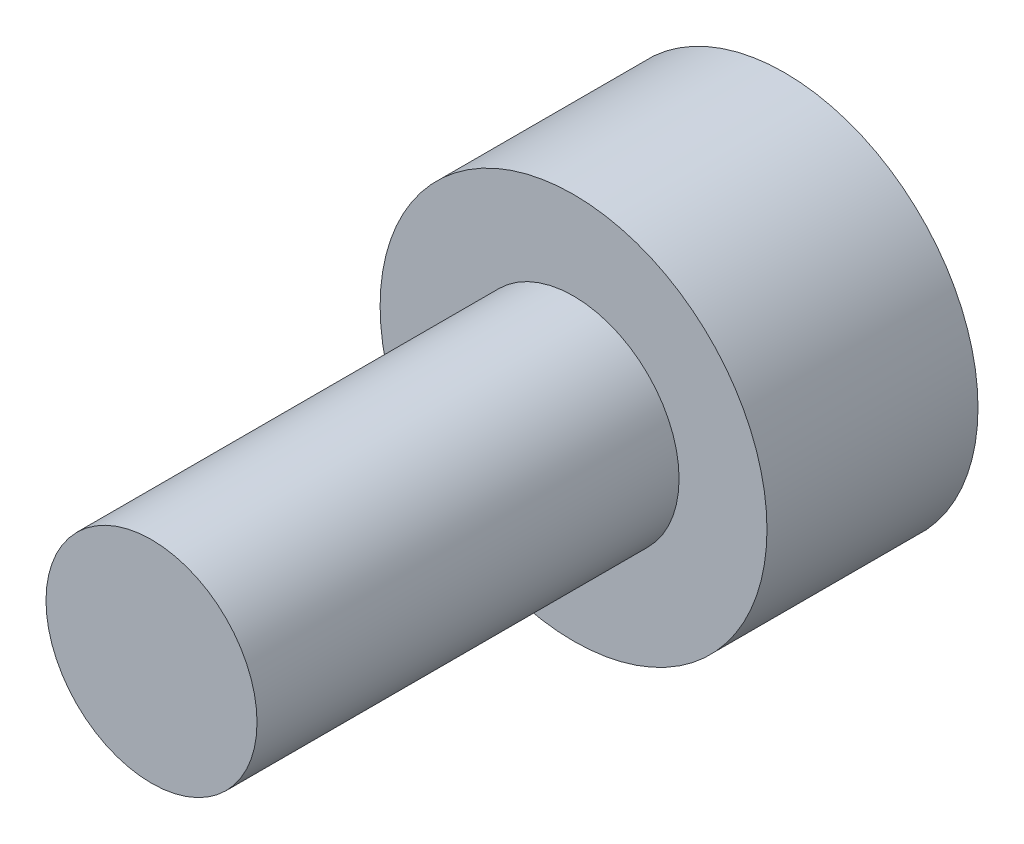
ISO-10303-21;
HEADER;
FILE_DESCRIPTION(('STEP AP214'),'2;1');
FILE_NAME('part.step','',(''),(''),'','','');
FILE_SCHEMA(('AUTOMOTIVE_DESIGN { 1 0 10303 214 1 1 1 1 }'));
ENDSEC;
DATA;
#1=APPLICATION_CONTEXT('core data for automotive mechanical design processes');
#2=APPLICATION_PROTOCOL_DEFINITION('international standard','automotive_design',2000,#1);
#3=PRODUCT_CONTEXT('',#1,'mechanical');
#4=PRODUCT('Part','Part','',(#3));
#5=PRODUCT_RELATED_PRODUCT_CATEGORY('part','',(#4));
#6=PRODUCT_DEFINITION_FORMATION('','',#4);
#7=PRODUCT_DEFINITION_CONTEXT('part definition',#1,'design');
#8=PRODUCT_DEFINITION('design','',#6,#7);
#9=PRODUCT_DEFINITION_SHAPE('','',#8);
#10=(LENGTH_UNIT() NAMED_UNIT(*) SI_UNIT(.MILLI.,.METRE.));
#11=(NAMED_UNIT(*) PLANE_ANGLE_UNIT() SI_UNIT($,.RADIAN.));
#12=(NAMED_UNIT(*) SI_UNIT($,.STERADIAN.) SOLID_ANGLE_UNIT());
#13=UNCERTAINTY_MEASURE_WITH_UNIT(LENGTH_MEASURE(1.E-05),#10,'distance_accuracy_value','');
#14=(GEOMETRIC_REPRESENTATION_CONTEXT(3) GLOBAL_UNCERTAINTY_ASSIGNED_CONTEXT((#13)) GLOBAL_UNIT_ASSIGNED_CONTEXT((#10,
#11,#12)) REPRESENTATION_CONTEXT('',''));
#15=CARTESIAN_POINT('',(0.,0.,0.));
#16=DIRECTION('',(0.,0.,1.));
#17=DIRECTION('',(1.,0.,0.));
#18=AXIS2_PLACEMENT_3D('',#15,#16,#17);
#19=CARTESIAN_POINT('',(0.,0.,0.));
#20=DIRECTION('',(0.,0.,1.));
#21=DIRECTION('',(1.,0.,0.));
#22=AXIS2_PLACEMENT_3D('',#19,#20,#21);
#23=PLANE('',#22);
#24=CARTESIAN_POINT('',(0.,0.,0.));
#25=DIRECTION('',(0.,0.,1.));
#26=DIRECTION('',(1.,0.,0.));
#27=AXIS2_PLACEMENT_3D('',#24,#25,#26);
#28=CIRCLE('',#27,2.75);
#29=CARTESIAN_POINT('',(2.75,0.,0.));
#30=VERTEX_POINT('',#29);
#31=EDGE_CURVE('E37',#30,#30,#28,.T.);
#32=ORIENTED_EDGE('',*,*,#31,.T.);
#33=EDGE_LOOP('',(#32));
#34=FACE_BOUND('',#33,.T.);
#35=CARTESIAN_POINT('',(0.,0.,0.));
#36=DIRECTION('',(0.,0.,1.));
#37=DIRECTION('',(1.,0.,0.));
#38=AXIS2_PLACEMENT_3D('',#35,#36,#37);
#39=CIRCLE('',#38,1.5);
#40=CARTESIAN_POINT('',(1.5,0.,0.));
#41=VERTEX_POINT('',#40);
#42=EDGE_CURVE('E46',#41,#41,#39,.T.);
#43=ORIENTED_EDGE('',*,*,#42,.F.);
#44=EDGE_LOOP('',(#43));
#45=FACE_BOUND('',#44,.T.);
#46=ADVANCED_FACE('F33',(#34,#45),#23,.T.);
#47=CARTESIAN_POINT('',(0.,0.,-3.));
#48=DIRECTION('',(0.,0.,1.));
#49=DIRECTION('',(1.,0.,0.));
#50=AXIS2_PLACEMENT_3D('',#47,#48,#49);
#51=CYLINDRICAL_SURFACE('',#50,2.75);
#52=CARTESIAN_POINT('',(0.,0.,-3.));
#53=DIRECTION('',(0.,0.,1.));
#54=DIRECTION('',(1.,0.,0.));
#55=AXIS2_PLACEMENT_3D('',#52,#53,#54);
#56=CIRCLE('',#55,2.75);
#57=CARTESIAN_POINT('',(2.75,0.,-3.));
#58=VERTEX_POINT('',#57);
#59=EDGE_CURVE('E10',#58,#58,#56,.T.);
#60=ORIENTED_EDGE('',*,*,#59,.T.);
#61=EDGE_LOOP('',(#60));
#62=FACE_BOUND('',#61,.T.);
#63=ORIENTED_EDGE('',*,*,#31,.F.);
#64=EDGE_LOOP('',(#63));
#65=FACE_BOUND('',#64,.T.);
#66=ADVANCED_FACE('F35',(#62,#65),#51,.T.);
#67=CARTESIAN_POINT('',(0.,0.,-3.));
#68=DIRECTION('',(0.,0.,1.));
#69=DIRECTION('',(1.,0.,0.));
#70=AXIS2_PLACEMENT_3D('',#67,#68,#69);
#71=PLANE('',#70);
#72=ORIENTED_EDGE('',*,*,#59,.F.);
#73=EDGE_LOOP('',(#72));
#74=FACE_BOUND('',#73,.T.);
#75=ADVANCED_FACE('F57',(#74),#71,.F.);
#76=CARTESIAN_POINT('',(0.,0.,6.));
#77=DIRECTION('',(0.,0.,-1.));
#78=DIRECTION('',(-1.,0.,0.));
#79=AXIS2_PLACEMENT_3D('',#76,#77,#78);
#80=CYLINDRICAL_SURFACE('',#79,1.5);
#81=CARTESIAN_POINT('',(0.,0.,6.));
#82=DIRECTION('',(0.,0.,1.));
#83=DIRECTION('',(1.,0.,0.));
#84=AXIS2_PLACEMENT_3D('',#81,#82,#83);
#85=CIRCLE('',#84,1.5);
#86=CARTESIAN_POINT('',(1.5,0.,6.));
#87=VERTEX_POINT('',#86);
#88=EDGE_CURVE('E44',#87,#87,#85,.T.);
#89=ORIENTED_EDGE('',*,*,#88,.F.);
#90=EDGE_LOOP('',(#89));
#91=FACE_BOUND('',#90,.T.);
#92=ORIENTED_EDGE('',*,*,#42,.T.);
#93=EDGE_LOOP('',(#92));
#94=FACE_BOUND('',#93,.T.);
#95=ADVANCED_FACE('F54',(#91,#94),#80,.T.);
#96=CARTESIAN_POINT('',(0.,0.,6.));
#97=DIRECTION('',(0.,0.,1.));
#98=DIRECTION('',(1.,0.,0.));
#99=AXIS2_PLACEMENT_3D('',#96,#97,#98);
#100=PLANE('',#99);
#101=ORIENTED_EDGE('',*,*,#88,.T.);
#102=EDGE_LOOP('',(#101));
#103=FACE_BOUND('',#102,.T.);
#104=ADVANCED_FACE('F52',(#103),#100,.T.);
#105=CLOSED_SHELL('',(#46,#66,#75,#95,#104));
#106=MANIFOLD_SOLID_BREP('B2',#105);
#107=ADVANCED_BREP_SHAPE_REPRESENTATION('',(#18,#106),#14);
#108=SHAPE_DEFINITION_REPRESENTATION(#9,#107);
ENDSEC;
END-ISO-10303-21;
